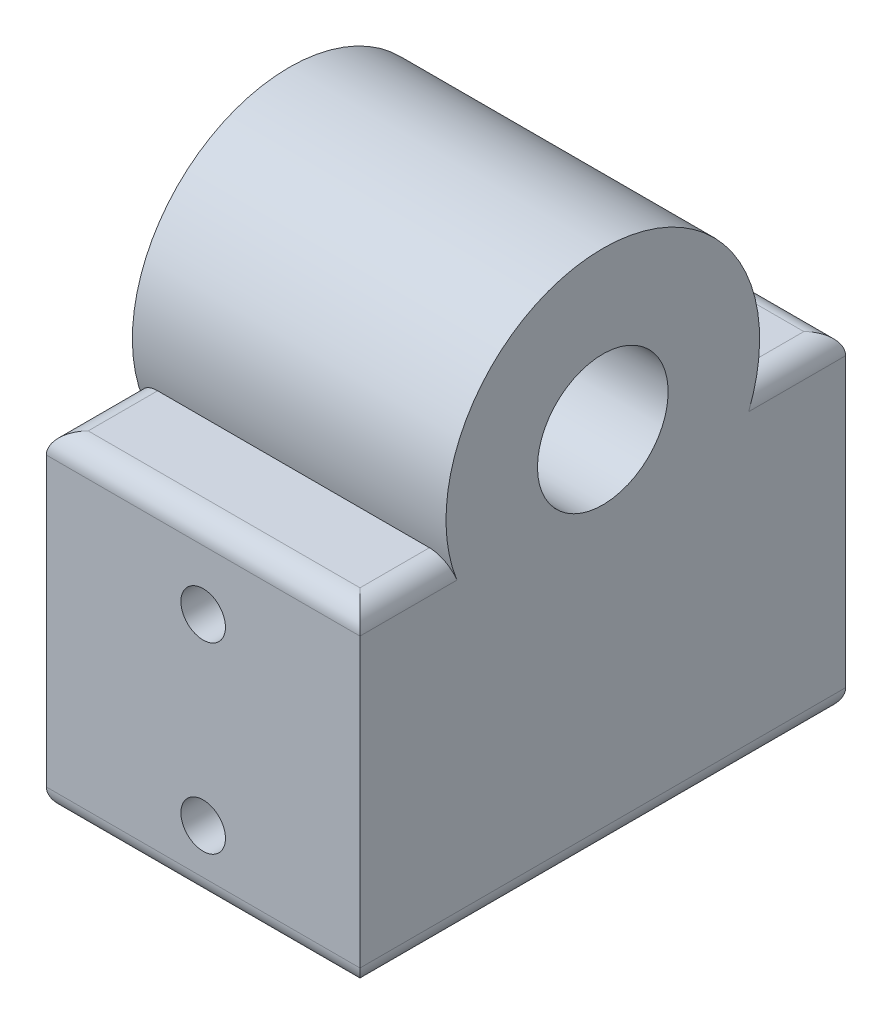
ISO-10303-21;
HEADER;
FILE_DESCRIPTION(('STEP AP214'),'2;1');
FILE_NAME('part.step','',(''),(''),'','','');
FILE_SCHEMA(('AUTOMOTIVE_DESIGN { 1 0 10303 214 1 1 1 1 }'));
ENDSEC;
DATA;
#1=APPLICATION_CONTEXT('core data for automotive mechanical design processes');
#2=APPLICATION_PROTOCOL_DEFINITION('international standard','automotive_design',2000,#1);
#3=PRODUCT_CONTEXT('',#1,'mechanical');
#4=PRODUCT('Part','Part','',(#3));
#5=PRODUCT_RELATED_PRODUCT_CATEGORY('part','',(#4));
#6=PRODUCT_DEFINITION_FORMATION('','',#4);
#7=PRODUCT_DEFINITION_CONTEXT('part definition',#1,'design');
#8=PRODUCT_DEFINITION('design','',#6,#7);
#9=PRODUCT_DEFINITION_SHAPE('','',#8);
#10=(LENGTH_UNIT() NAMED_UNIT(*) SI_UNIT(.MILLI.,.METRE.));
#11=(NAMED_UNIT(*) PLANE_ANGLE_UNIT() SI_UNIT($,.RADIAN.));
#12=(NAMED_UNIT(*) SI_UNIT($,.STERADIAN.) SOLID_ANGLE_UNIT());
#13=UNCERTAINTY_MEASURE_WITH_UNIT(LENGTH_MEASURE(1.E-05),#10,'distance_accuracy_value','');
#14=(GEOMETRIC_REPRESENTATION_CONTEXT(3) GLOBAL_UNCERTAINTY_ASSIGNED_CONTEXT((#13)) GLOBAL_UNIT_ASSIGNED_CONTEXT((#10,
#11,#12)) REPRESENTATION_CONTEXT('',''));
#15=CARTESIAN_POINT('',(0.,0.,0.));
#16=DIRECTION('',(0.,0.,1.));
#17=DIRECTION('',(1.,0.,0.));
#18=AXIS2_PLACEMENT_3D('',#15,#16,#17);
#19=CARTESIAN_POINT('',(9.525,-31.75,14.75));
#20=DIRECTION('',(1.,0.,0.));
#21=DIRECTION('',(0.,0.,-1.));
#22=AXIS2_PLACEMENT_3D('',#19,#20,#21);
#23=PLANE('',#22);
#24=CARTESIAN_POINT('',(9.525,-9.525,0.));
#25=DIRECTION('',(-1.,0.,0.));
#26=DIRECTION('',(0.,0.,1.));
#27=AXIS2_PLACEMENT_3D('',#24,#25,#26);
#28=CIRCLE('',#27,3.96875);
#29=CARTESIAN_POINT('',(9.525,-9.525,3.96875));
#30=VERTEX_POINT('',#29);
#31=EDGE_CURVE('E152',#30,#30,#28,.T.);
#32=ORIENTED_EDGE('',*,*,#31,.T.);
#33=EDGE_LOOP('',(#32));
#34=FACE_BOUND('',#33,.T.);
#35=DIRECTION('',(0.,1.,0.));
#36=VECTOR('',#35,1.);
#37=CARTESIAN_POINT('',(9.525,-31.75,-14.75));
#38=LINE('',#37,#36);
#39=CARTESIAN_POINT('',(9.525,-30.48,-14.75));
#40=VERTEX_POINT('',#39);
#41=CARTESIAN_POINT('',(9.525,-13.02,-14.75));
#42=VERTEX_POINT('',#41);
#43=EDGE_CURVE('E131',#40,#42,#38,.T.);
#44=ORIENTED_EDGE('',*,*,#43,.T.);
#45=DIRECTION('',(0.,0.,-1.));
#46=VECTOR('',#45,1.);
#47=CARTESIAN_POINT('',(9.525,-13.02,-9.26147936347104));
#48=LINE('',#47,#46);
#49=CARTESIAN_POINT('',(9.525,-13.02,-8.86062074574914));
#50=VERTEX_POINT('',#49);
#51=EDGE_CURVE('E192',#42,#50,#48,.F.);
#52=ORIENTED_EDGE('',*,*,#51,.T.);
#53=CARTESIAN_POINT('',(9.525,-9.525,0.));
#54=DIRECTION('',(1.,0.,0.));
#55=DIRECTION('',(0.,0.,-1.));
#56=AXIS2_PLACEMENT_3D('',#53,#54,#55);
#57=CIRCLE('',#56,9.525);
#58=CARTESIAN_POINT('',(9.525,-13.02,8.86062074574914));
#59=VERTEX_POINT('',#58);
#60=EDGE_CURVE('E314',#50,#59,#57,.T.);
#61=ORIENTED_EDGE('',*,*,#60,.T.);
#62=DIRECTION('',(0.,0.,-1.));
#63=VECTOR('',#62,1.);
#64=CARTESIAN_POINT('',(9.525,-13.02,14.75));
#65=LINE('',#64,#63);
#66=CARTESIAN_POINT('',(9.525,-13.02,14.75));
#67=VERTEX_POINT('',#66);
#68=EDGE_CURVE('E138',#59,#67,#65,.F.);
#69=ORIENTED_EDGE('',*,*,#68,.T.);
#70=DIRECTION('',(0.,1.,0.));
#71=VECTOR('',#70,1.);
#72=CARTESIAN_POINT('',(9.525,-31.75,14.75));
#73=LINE('',#72,#71);
#74=CARTESIAN_POINT('',(9.525,-30.48,14.75));
#75=VERTEX_POINT('',#74);
#76=EDGE_CURVE('E133',#75,#67,#73,.T.);
#77=ORIENTED_EDGE('',*,*,#76,.F.);
#78=DIRECTION('',(0.,0.,-1.));
#79=VECTOR('',#78,1.);
#80=CARTESIAN_POINT('',(9.525,-30.48,14.75));
#81=LINE('',#80,#79);
#82=EDGE_CURVE('E128',#75,#40,#81,.T.);
#83=ORIENTED_EDGE('',*,*,#82,.T.);
#84=EDGE_LOOP('',(#44,#52,#61,#69,#77,#83));
#85=FACE_BOUND('',#84,.T.);
#86=ADVANCED_FACE('F34',(#34,#85),#23,.T.);
#87=CARTESIAN_POINT('',(-9.525,-31.75,14.75));
#88=DIRECTION('',(-1.,0.,0.));
#89=DIRECTION('',(0.,0.,1.));
#90=AXIS2_PLACEMENT_3D('',#87,#88,#89);
#91=PLANE('',#90);
#92=CARTESIAN_POINT('',(-9.525,-9.525,0.));
#93=DIRECTION('',(-1.,0.,0.));
#94=DIRECTION('',(0.,0.,1.));
#95=AXIS2_PLACEMENT_3D('',#92,#93,#94);
#96=CIRCLE('',#95,3.96875);
#97=CARTESIAN_POINT('',(-9.525,-9.525,3.96875));
#98=VERTEX_POINT('',#97);
#99=EDGE_CURVE('E285',#98,#98,#96,.T.);
#100=ORIENTED_EDGE('',*,*,#99,.F.);
#101=EDGE_LOOP('',(#100));
#102=FACE_BOUND('',#101,.T.);
#103=CARTESIAN_POINT('',(-9.525,-9.525,0.));
#104=DIRECTION('',(1.,0.,0.));
#105=DIRECTION('',(0.,0.,-1.));
#106=AXIS2_PLACEMENT_3D('',#103,#104,#105);
#107=CIRCLE('',#106,9.525);
#108=CARTESIAN_POINT('',(-9.525,-13.02,-8.86062074574914));
#109=VERTEX_POINT('',#108);
#110=CARTESIAN_POINT('',(-9.525,-13.02,8.86062074574914));
#111=VERTEX_POINT('',#110);
#112=EDGE_CURVE('E316',#109,#111,#107,.T.);
#113=ORIENTED_EDGE('',*,*,#112,.F.);
#114=DIRECTION('',(0.,0.,-1.));
#115=VECTOR('',#114,1.);
#116=CARTESIAN_POINT('',(-9.525,-13.02,-14.75));
#117=LINE('',#116,#115);
#118=CARTESIAN_POINT('',(-9.525,-13.02,-14.75));
#119=VERTEX_POINT('',#118);
#120=EDGE_CURVE('E179',#109,#119,#117,.T.);
#121=ORIENTED_EDGE('',*,*,#120,.T.);
#122=DIRECTION('',(0.,1.,0.));
#123=VECTOR('',#122,1.);
#124=CARTESIAN_POINT('',(-9.525,-31.75,-14.75));
#125=LINE('',#124,#123);
#126=CARTESIAN_POINT('',(-9.525,-30.48,-14.75));
#127=VERTEX_POINT('',#126);
#128=EDGE_CURVE('E151',#127,#119,#125,.T.);
#129=ORIENTED_EDGE('',*,*,#128,.F.);
#130=DIRECTION('',(0.,0.,1.));
#131=VECTOR('',#130,1.);
#132=CARTESIAN_POINT('',(-9.525,-30.48,14.75));
#133=LINE('',#132,#131);
#134=CARTESIAN_POINT('',(-9.525,-30.48,14.75));
#135=VERTEX_POINT('',#134);
#136=EDGE_CURVE('E173',#127,#135,#133,.T.);
#137=ORIENTED_EDGE('',*,*,#136,.T.);
#138=DIRECTION('',(0.,1.,0.));
#139=VECTOR('',#138,1.);
#140=CARTESIAN_POINT('',(-9.525,-31.75,14.75));
#141=LINE('',#140,#139);
#142=CARTESIAN_POINT('',(-9.525,-13.02,14.75));
#143=VERTEX_POINT('',#142);
#144=EDGE_CURVE('E164',#135,#143,#141,.T.);
#145=ORIENTED_EDGE('',*,*,#144,.T.);
#146=DIRECTION('',(0.,0.,-1.));
#147=VECTOR('',#146,1.);
#148=CARTESIAN_POINT('',(-9.525,-13.02,9.26147936347104));
#149=LINE('',#148,#147);
#150=EDGE_CURVE('E176',#143,#111,#149,.T.);
#151=ORIENTED_EDGE('',*,*,#150,.T.);
#152=EDGE_LOOP('',(#113,#121,#129,#137,#145,#151));
#153=FACE_BOUND('',#152,.T.);
#154=ADVANCED_FACE('F251',(#102,#153),#91,.T.);
#155=CARTESIAN_POINT('',(-9.525,-31.75,14.75));
#156=DIRECTION('',(0.,0.,1.));
#157=DIRECTION('',(1.,0.,0.));
#158=AXIS2_PLACEMENT_3D('',#155,#156,#157);
#159=PLANE('',#158);
#160=ORIENTED_EDGE('',*,*,#76,.T.);
#161=DIRECTION('',(1.,0.,0.));
#162=VECTOR('',#161,1.);
#163=CARTESIAN_POINT('',(-9.525,-13.02,14.75));
#164=LINE('',#163,#162);
#165=EDGE_CURVE('E139',#67,#143,#164,.F.);
#166=ORIENTED_EDGE('',*,*,#165,.T.);
#167=ORIENTED_EDGE('',*,*,#144,.F.);
#168=DIRECTION('',(1.,0.,0.));
#169=VECTOR('',#168,1.);
#170=CARTESIAN_POINT('',(-9.525,-30.48,14.75));
#171=LINE('',#170,#169);
#172=EDGE_CURVE('E188',#135,#75,#171,.T.);
#173=ORIENTED_EDGE('',*,*,#172,.T.);
#174=EDGE_LOOP('',(#160,#166,#167,#173));
#175=FACE_BOUND('',#174,.T.);
#176=CARTESIAN_POINT('',(0.,-27.75,14.75));
#177=DIRECTION('',(0.,0.,1.));
#178=DIRECTION('',(1.,0.,0.));
#179=AXIS2_PLACEMENT_3D('',#176,#177,#178);
#180=CIRCLE('',#179,1.35254999999999);
#181=CARTESIAN_POINT('',(1.35254999999999,-27.75,14.75));
#182=VERTEX_POINT('',#181);
#183=EDGE_CURVE('E288',#182,#182,#180,.T.);
#184=ORIENTED_EDGE('',*,*,#183,.F.);
#185=EDGE_LOOP('',(#184));
#186=FACE_BOUND('',#185,.T.);
#187=CARTESIAN_POINT('',(0.,-16.6375,14.75));
#188=DIRECTION('',(0.,0.,1.));
#189=DIRECTION('',(1.,0.,0.));
#190=AXIS2_PLACEMENT_3D('',#187,#188,#189);
#191=CIRCLE('',#190,1.35254999999999);
#192=CARTESIAN_POINT('',(1.35254999999999,-16.6375,14.75));
#193=VERTEX_POINT('',#192);
#194=EDGE_CURVE('E281',#193,#193,#191,.T.);
#195=ORIENTED_EDGE('',*,*,#194,.F.);
#196=EDGE_LOOP('',(#195));
#197=FACE_BOUND('',#196,.T.);
#198=ADVANCED_FACE('F256',(#175,#186,#197),#159,.T.);
#199=CARTESIAN_POINT('',(-9.525,-31.75,-14.75));
#200=DIRECTION('',(0.,0.,-1.));
#201=DIRECTION('',(-1.,0.,0.));
#202=AXIS2_PLACEMENT_3D('',#199,#200,#201);
#203=PLANE('',#202);
#204=ORIENTED_EDGE('',*,*,#128,.T.);
#205=DIRECTION('',(1.,0.,0.));
#206=VECTOR('',#205,1.);
#207=CARTESIAN_POINT('',(9.525,-13.02,-14.75));
#208=LINE('',#207,#206);
#209=EDGE_CURVE('E150',#119,#42,#208,.T.);
#210=ORIENTED_EDGE('',*,*,#209,.T.);
#211=ORIENTED_EDGE('',*,*,#43,.F.);
#212=DIRECTION('',(-1.,0.,0.));
#213=VECTOR('',#212,1.);
#214=CARTESIAN_POINT('',(-9.525,-30.48,-14.75));
#215=LINE('',#214,#213);
#216=EDGE_CURVE('E147',#40,#127,#215,.T.);
#217=ORIENTED_EDGE('',*,*,#216,.T.);
#218=EDGE_LOOP('',(#204,#210,#211,#217));
#219=FACE_BOUND('',#218,.T.);
#220=CARTESIAN_POINT('',(0.,-27.75,-14.75));
#221=DIRECTION('',(0.,0.,1.));
#222=DIRECTION('',(1.,0.,0.));
#223=AXIS2_PLACEMENT_3D('',#220,#221,#222);
#224=CIRCLE('',#223,1.35255);
#225=CARTESIAN_POINT('',(1.35254999999999,-27.75,-14.75));
#226=VERTEX_POINT('',#225);
#227=EDGE_CURVE('E283',#226,#226,#224,.T.);
#228=ORIENTED_EDGE('',*,*,#227,.T.);
#229=EDGE_LOOP('',(#228));
#230=FACE_BOUND('',#229,.T.);
#231=CARTESIAN_POINT('',(0.,-16.6375,-14.75));
#232=DIRECTION('',(0.,0.,1.));
#233=DIRECTION('',(1.,0.,0.));
#234=AXIS2_PLACEMENT_3D('',#231,#232,#233);
#235=CIRCLE('',#234,1.35255);
#236=CARTESIAN_POINT('',(1.35254999999999,-16.6375,-14.75));
#237=VERTEX_POINT('',#236);
#238=EDGE_CURVE('E278',#237,#237,#235,.T.);
#239=ORIENTED_EDGE('',*,*,#238,.T.);
#240=EDGE_LOOP('',(#239));
#241=FACE_BOUND('',#240,.T.);
#242=ADVANCED_FACE('F144',(#219,#230,#241),#203,.T.);
#243=CARTESIAN_POINT('',(9.52499999999999,-31.75,-14.75));
#244=DIRECTION('',(0.,-1.,0.));
#245=DIRECTION('',(0.,0.,-1.));
#246=AXIS2_PLACEMENT_3D('',#243,#244,#245);
#247=PLANE('',#246);
#248=DIRECTION('',(1.,0.,0.));
#249=VECTOR('',#248,1.);
#250=CARTESIAN_POINT('',(9.52499999999999,-31.75,13.48));
#251=LINE('',#250,#249);
#252=CARTESIAN_POINT('',(8.255,-31.75,13.48));
#253=VERTEX_POINT('',#252);
#254=CARTESIAN_POINT('',(-8.255,-31.75,13.48));
#255=VERTEX_POINT('',#254);
#256=EDGE_CURVE('E59',#253,#255,#251,.F.);
#257=ORIENTED_EDGE('',*,*,#256,.T.);
#258=DIRECTION('',(0.,0.,1.));
#259=VECTOR('',#258,1.);
#260=CARTESIAN_POINT('',(-8.255,-31.75,-14.75));
#261=LINE('',#260,#259);
#262=CARTESIAN_POINT('',(-8.255,-31.75,-13.48));
#263=VERTEX_POINT('',#262);
#264=EDGE_CURVE('E198',#255,#263,#261,.F.);
#265=ORIENTED_EDGE('',*,*,#264,.T.);
#266=DIRECTION('',(-1.,0.,0.));
#267=VECTOR('',#266,1.);
#268=CARTESIAN_POINT('',(9.52499999999999,-31.75,-13.48));
#269=LINE('',#268,#267);
#270=CARTESIAN_POINT('',(8.255,-31.75,-13.48));
#271=VERTEX_POINT('',#270);
#272=EDGE_CURVE('E196',#263,#271,#269,.F.);
#273=ORIENTED_EDGE('',*,*,#272,.T.);
#274=DIRECTION('',(0.,0.,-1.));
#275=VECTOR('',#274,1.);
#276=CARTESIAN_POINT('',(8.255,-31.75,-14.75));
#277=LINE('',#276,#275);
#278=EDGE_CURVE('E156',#271,#253,#277,.F.);
#279=ORIENTED_EDGE('',*,*,#278,.T.);
#280=EDGE_LOOP('',(#257,#265,#273,#279));
#281=FACE_BOUND('',#280,.T.);
#282=ADVANCED_FACE('F255',(#281),#247,.T.);
#283=CARTESIAN_POINT('',(9.525,-9.525,0.));
#284=DIRECTION('',(-1.,0.,0.));
#285=DIRECTION('',(0.,0.,1.));
#286=AXIS2_PLACEMENT_3D('',#283,#284,#285);
#287=CYLINDRICAL_SURFACE('',#286,3.96875);
#288=CARTESIAN_POINT('',(9.525,-9.525,3.96875));
#289=CARTESIAN_POINT('',(9.3265625,-9.525,3.96875));
#290=CARTESIAN_POINT('',(9.128125,-9.525,3.96875));
#291=CARTESIAN_POINT('',(8.73125,-9.525,3.96875));
#292=CARTESIAN_POINT('',(8.5328125,-9.525,3.96875));
#293=CARTESIAN_POINT('',(8.1359375,-9.525,3.96875));
#294=CARTESIAN_POINT('',(7.9375,-9.525,3.96875));
#295=CARTESIAN_POINT('',(7.540625,-9.525,3.96875));
#296=CARTESIAN_POINT('',(7.3421875,-9.525,3.96875));
#297=CARTESIAN_POINT('',(6.9453125,-9.525,3.96875));
#298=CARTESIAN_POINT('',(6.746875,-9.525,3.96875));
#299=CARTESIAN_POINT('',(6.35,-9.525,3.96875));
#300=CARTESIAN_POINT('',(6.1515625,-9.525,3.96875));
#301=CARTESIAN_POINT('',(5.7546875,-9.525,3.96875));
#302=CARTESIAN_POINT('',(5.55625,-9.525,3.96875));
#303=CARTESIAN_POINT('',(5.159375,-9.525,3.96875));
#304=CARTESIAN_POINT('',(4.9609375,-9.525,3.96875));
#305=CARTESIAN_POINT('',(4.5640625,-9.525,3.96875));
#306=CARTESIAN_POINT('',(4.365625,-9.525,3.96875));
#307=CARTESIAN_POINT('',(3.96875,-9.525,3.96875));
#308=CARTESIAN_POINT('',(3.7703125,-9.525,3.96875));
#309=CARTESIAN_POINT('',(3.3734375,-9.525,3.96875));
#310=CARTESIAN_POINT('',(3.175,-9.525,3.96875));
#311=CARTESIAN_POINT('',(2.778125,-9.525,3.96875));
#312=CARTESIAN_POINT('',(2.5796875,-9.525,3.96875));
#313=CARTESIAN_POINT('',(2.1828125,-9.525,3.96875));
#314=CARTESIAN_POINT('',(1.984375,-9.525,3.96875));
#315=CARTESIAN_POINT('',(1.5875,-9.525,3.96875));
#316=CARTESIAN_POINT('',(1.3890625,-9.525,3.96875));
#317=CARTESIAN_POINT('',(0.992187499999999,-9.525,3.96875));
#318=CARTESIAN_POINT('',(0.793749999999999,-9.525,3.96875));
#319=CARTESIAN_POINT('',(0.396874999999998,-9.525,3.96875));
#320=CARTESIAN_POINT('',(0.198437499999998,-9.525,3.96875));
#321=CARTESIAN_POINT('',(-0.198437500000002,-9.525,3.96875));
#322=CARTESIAN_POINT('',(-0.396875000000002,-9.525,3.96875));
#323=CARTESIAN_POINT('',(-0.793750000000002,-9.525,3.96875));
#324=CARTESIAN_POINT('',(-0.992187500000002,-9.525,3.96875));
#325=CARTESIAN_POINT('',(-1.3890625,-9.525,3.96875));
#326=CARTESIAN_POINT('',(-1.5875,-9.525,3.96875));
#327=CARTESIAN_POINT('',(-1.984375,-9.525,3.96875));
#328=CARTESIAN_POINT('',(-2.1828125,-9.525,3.96875));
#329=CARTESIAN_POINT('',(-2.5796875,-9.525,3.96875));
#330=CARTESIAN_POINT('',(-2.778125,-9.525,3.96875));
#331=CARTESIAN_POINT('',(-3.175,-9.525,3.96875));
#332=CARTESIAN_POINT('',(-3.3734375,-9.525,3.96875));
#333=CARTESIAN_POINT('',(-3.7703125,-9.525,3.96875));
#334=CARTESIAN_POINT('',(-3.96875,-9.525,3.96875));
#335=CARTESIAN_POINT('',(-4.365625,-9.525,3.96875));
#336=CARTESIAN_POINT('',(-4.5640625,-9.525,3.96875));
#337=CARTESIAN_POINT('',(-4.9609375,-9.525,3.96875));
#338=CARTESIAN_POINT('',(-5.159375,-9.525,3.96875));
#339=CARTESIAN_POINT('',(-5.55625,-9.525,3.96875));
#340=CARTESIAN_POINT('',(-5.7546875,-9.525,3.96875));
#341=CARTESIAN_POINT('',(-6.1515625,-9.525,3.96875));
#342=CARTESIAN_POINT('',(-6.35,-9.525,3.96875));
#343=CARTESIAN_POINT('',(-6.746875,-9.525,3.96875));
#344=CARTESIAN_POINT('',(-6.9453125,-9.525,3.96875));
#345=CARTESIAN_POINT('',(-7.3421875,-9.525,3.96875));
#346=CARTESIAN_POINT('',(-7.540625,-9.525,3.96875));
#347=CARTESIAN_POINT('',(-7.9375,-9.525,3.96875));
#348=CARTESIAN_POINT('',(-8.1359375,-9.525,3.96875));
#349=CARTESIAN_POINT('',(-8.5328125,-9.525,3.96875));
#350=CARTESIAN_POINT('',(-8.73125,-9.525,3.96875));
#351=CARTESIAN_POINT('',(-9.128125,-9.525,3.96875));
#352=CARTESIAN_POINT('',(-9.3265625,-9.525,3.96875));
#353=CARTESIAN_POINT('',(-9.525,-9.525,3.96875));
#354=B_SPLINE_CURVE_WITH_KNOTS('',3,(#288,#289,#290,#291,#292,#293,#294,#295,#296,#297,#298,
#299,#300,#301,#302,#303,#304,#305,#306,#307,#308,#309,#310,#311,#312,#313,#314,#315,#316,#317,
#318,#319,#320,#321,#322,#323,#324,#325,#326,#327,#328,#329,#330,#331,#332,#333,#334,#335,#336,
#337,#338,#339,#340,#341,#342,#343,#344,#345,#346,#347,#348,#349,#350,#351,#352,#353),
.UNSPECIFIED.,.F.,.F.,(4,2,2,2,2,2,2,2,2,2,2,2,2,2,2,2,2,2,2,2,2,2,2,2,2,2,2,2,2,2,2,2,4),(0.,
0.595312499999999,1.190625,1.7859375,2.38125,2.9765625,3.571875,4.1671875,4.7625,5.3578125,
5.953125,6.5484375,7.14375,7.7390625,8.334375,8.9296875,9.525,10.1203125,10.715625,11.3109375,
11.90625,12.5015625,13.096875,13.6921875,14.2875,14.8828125,15.478125,16.0734375,16.66875,
17.2640625,17.859375,18.4546875,19.05),.UNSPECIFIED.);
#355=EDGE_CURVE('BSEAM265',#30,#98,#354,.T.);
#356=ORIENTED_EDGE('',*,*,#31,.F.);
#357=ORIENTED_EDGE('',*,*,#99,.T.);
#358=ORIENTED_EDGE('',*,*,#355,.T.);
#359=ORIENTED_EDGE('',*,*,#355,.F.);
#360=EDGE_LOOP('',(#356,#358,#357,#359));
#361=FACE_BOUND('',#360,.T.);
#362=ADVANCED_FACE('F265',(#361),#287,.F.);
#363=CARTESIAN_POINT('',(0.,-16.6375,14.75));
#364=DIRECTION('',(0.,0.,1.));
#365=DIRECTION('',(1.,0.,0.));
#366=AXIS2_PLACEMENT_3D('',#363,#364,#365);
#367=CYLINDRICAL_SURFACE('',#366,1.35254999999999);
#368=ORIENTED_EDGE('',*,*,#238,.F.);
#369=EDGE_LOOP('',(#368));
#370=FACE_BOUND('',#369,.T.);
#371=ORIENTED_EDGE('',*,*,#194,.T.);
#372=EDGE_LOOP('',(#371));
#373=FACE_BOUND('',#372,.T.);
#374=ADVANCED_FACE('F267',(#370,#373),#367,.F.);
#375=CARTESIAN_POINT('',(0.,-27.75,14.75));
#376=DIRECTION('',(0.,0.,1.));
#377=DIRECTION('',(1.,0.,0.));
#378=AXIS2_PLACEMENT_3D('',#375,#376,#377);
#379=CYLINDRICAL_SURFACE('',#378,1.35254999999999);
#380=ORIENTED_EDGE('',*,*,#227,.F.);
#381=EDGE_LOOP('',(#380));
#382=FACE_BOUND('',#381,.T.);
#383=ORIENTED_EDGE('',*,*,#183,.T.);
#384=EDGE_LOOP('',(#383));
#385=FACE_BOUND('',#384,.T.);
#386=ADVANCED_FACE('F224',(#382,#385),#379,.F.);
#387=CARTESIAN_POINT('',(-9.525,-9.525,0.));
#388=DIRECTION('',(1.,0.,0.));
#389=DIRECTION('',(0.,0.,-1.));
#390=AXIS2_PLACEMENT_3D('',#387,#388,#389);
#391=CYLINDRICAL_SURFACE('',#390,9.525);
#392=ORIENTED_EDGE('',*,*,#60,.F.);
#393=CARTESIAN_POINT('',(9.525,-13.02,-8.86062074574914));
#394=CARTESIAN_POINT('',(9.52499852252124,-12.9837594555083,-8.87491679310546));
#395=CARTESIAN_POINT('',(9.52344763491596,-12.947444217534,-8.88898249490261));
#396=CARTESIAN_POINT('',(9.51720715804546,-12.8748717904475,-8.91658505816372));
#397=CARTESIAN_POINT('',(9.51251670466538,-12.8386146200721,-8.93012177294661));
#398=CARTESIAN_POINT('',(9.49366705606685,-12.7302121082215,-8.96984631742909));
#399=CARTESIAN_POINT('',(9.4747294403631,-12.6584962313584,-8.9951247397921));
#400=CARTESIAN_POINT('',(9.42415425566406,-12.51846568558,-9.04269213892352));
#401=CARTESIAN_POINT('',(9.39248990705215,-12.4501585321737,-9.06497467897476));
#402=CARTESIAN_POINT('',(9.31703409311256,-12.3195288290174,-9.10609233824763));
#403=CARTESIAN_POINT('',(9.27325690856722,-12.2571993475341,-9.12493147400341));
#404=CARTESIAN_POINT('',(9.17702337334126,-12.1436162789671,-9.15815577536195));
#405=CARTESIAN_POINT('',(9.12508249276087,-12.0919754456382,-9.17271091631362));
#406=CARTESIAN_POINT('',(9.01256635222894,-11.9980606480837,-9.19847674745131));
#407=CARTESIAN_POINT('',(8.95198921642788,-11.9557887239538,-9.20968670940266));
#408=CARTESIAN_POINT('',(8.82672821707173,-11.88376469315,-9.22839019925457));
#409=CARTESIAN_POINT('',(8.76232280556198,-11.8535621894906,-9.23601977459137));
#410=CARTESIAN_POINT('',(8.62915155005819,-11.8042952912464,-9.2483019447314));
#411=CARTESIAN_POINT('',(8.56039025831628,-11.7852194744985,-9.25295759290517));
#412=CARTESIAN_POINT('',(8.4517036989843,-11.764701857239,-9.25793786569882));
#413=CARTESIAN_POINT('',(8.41254722546435,-11.7591907299943,-9.25926776933198));
#414=CARTESIAN_POINT('',(8.33393342437962,-11.7518417125628,-9.26103702416265));
#415=CARTESIAN_POINT('',(8.29447666769444,-11.7499980515437,-9.26147777447633));
#416=CARTESIAN_POINT('',(8.255,-11.75,-9.26147936347104));
#417=B_SPLINE_CURVE_WITH_KNOTS('',3,(#393,#394,#395,#396,#397,#398,#399,#400,#401,#402,#403,
#404,#405,#406,#407,#408,#409,#410,#411,#412,#413,#414,#415,#416),.UNSPECIFIED.,.F.,.F.,(4,2,2,
2,2,2,2,2,2,2,2,4),(0.,0.116811313541699,0.233654790742139,0.467534325253901,0.701908587770688,
0.936007696726002,1.15890627712569,1.38185334648571,1.5954581973756,1.80884338332348,
1.9273753283488,2.04572061296315),.UNSPECIFIED.);
#418=CARTESIAN_POINT('',(8.25499999999999,-11.75,-9.26147936347104));
#419=VERTEX_POINT('',#418);
#420=EDGE_CURVE('E43',#50,#419,#417,.T.);
#421=ORIENTED_EDGE('',*,*,#420,.T.);
#422=DIRECTION('',(1.,0.,0.));
#423=VECTOR('',#422,1.);
#424=CARTESIAN_POINT('',(-9.525,-11.75,-9.26147936347104));
#425=LINE('',#424,#423);
#426=CARTESIAN_POINT('',(-8.255,-11.75,-9.26147936347104));
#427=VERTEX_POINT('',#426);
#428=EDGE_CURVE('E306',#427,#419,#425,.T.);
#429=ORIENTED_EDGE('',*,*,#428,.F.);
#430=CARTESIAN_POINT('',(-8.255,-11.75,-9.26147936347104));
#431=CARTESIAN_POINT('',(-8.28988546416625,-11.7499997617744,-9.26147827397239));
#432=CARTESIAN_POINT('',(-8.32475409703772,-11.7514383558028,-9.26113393674278));
#433=CARTESIAN_POINT('',(-8.39423901803251,-11.7571743017108,-9.25975354665822));
#434=CARTESIAN_POINT('',(-8.42885532466467,-11.7614714417308,-9.2587175450656));
#435=CARTESIAN_POINT('',(-8.53185912083119,-11.7785982985028,-9.25457003499991));
#436=CARTESIAN_POINT('',(-8.59955188507159,-11.7956636368124,-9.25041905495199));
#437=CARTESIAN_POINT('',(-8.73101787834997,-11.8405341107289,-9.23928862839323));
#438=CARTESIAN_POINT('',(-8.79478969481093,-11.8683430909092,-9.23230816931951));
#439=CARTESIAN_POINT('',(-8.91666260680767,-11.9337756863117,-9.21545232152933));
#440=CARTESIAN_POINT('',(-8.97476403788935,-11.9713987203014,-9.20557710424923));
#441=CARTESIAN_POINT('',(-9.08413009873181,-12.0555123103738,-9.18281207468158));
#442=CARTESIAN_POINT('',(-9.13534424267374,-12.1020628569922,-9.16990172639049));
#443=CARTESIAN_POINT('',(-9.22919011262834,-12.2023385934781,-9.14112679187031));
#444=CARTESIAN_POINT('',(-9.27182119925102,-12.2560643173609,-9.1252619857199));
#445=CARTESIAN_POINT('',(-9.34851968611629,-12.3704066845409,-9.09026636281673));
#446=CARTESIAN_POINT('',(-9.38234875704403,-12.4311610722943,-9.07106436917676));
#447=CARTESIAN_POINT('',(-9.43944576369574,-12.5566003155145,-9.02991598310287));
#448=CARTESIAN_POINT('',(-9.46270941897814,-12.6212867519877,-9.00796848294706));
#449=CARTESIAN_POINT('',(-9.49544444755144,-12.7417563530861,-8.96557109416331));
#450=CARTESIAN_POINT('',(-9.50656805762352,-12.7972271046851,-8.9454810018504));
#451=CARTESIAN_POINT('',(-9.52134548100077,-12.9085403432749,-8.90398003913688));
#452=CARTESIAN_POINT('',(-9.52501444301737,-12.964381844571,-8.88257193853481));
#453=CARTESIAN_POINT('',(-9.525,-13.02,-8.86062074574913));
#454=B_SPLINE_CURVE_WITH_KNOTS('',3,(#430,#431,#432,#433,#434,#435,#436,#437,#438,#439,#440,
#441,#442,#443,#444,#445,#446,#447,#448,#449,#450,#451,#452,#453),.UNSPECIFIED.,.F.,.F.,(4,2,2,
2,2,2,2,2,2,2,2,4),(0.,0.10459167049381,0.209175590092228,0.417898017937991,0.626695205636104,
0.835480030228224,1.04572037702655,1.25597637977036,1.47144141584401,1.68699366709148,
1.866629975045,2.04590087456297),.UNSPECIFIED.);
#455=EDGE_CURVE('E200',#427,#109,#454,.T.);
#456=ORIENTED_EDGE('',*,*,#455,.T.);
#457=ORIENTED_EDGE('',*,*,#112,.T.);
#458=CARTESIAN_POINT('',(-9.525,-13.02,8.86062074574914));
#459=CARTESIAN_POINT('',(-9.52499852252125,-12.9837594555083,8.87491679310546));
#460=CARTESIAN_POINT('',(-9.52344763491596,-12.947444217534,8.88898249490261));
#461=CARTESIAN_POINT('',(-9.51720715804547,-12.8748717904475,8.91658505816372));
#462=CARTESIAN_POINT('',(-9.51251670466538,-12.8386146200721,8.93012177294662));
#463=CARTESIAN_POINT('',(-9.49366705606685,-12.7302121082215,8.96984631742909));
#464=CARTESIAN_POINT('',(-9.4747294403631,-12.6584962313584,8.9951247397921));
#465=CARTESIAN_POINT('',(-9.42415425566406,-12.51846568558,9.04269213892352));
#466=CARTESIAN_POINT('',(-9.39248990705215,-12.4501585321737,9.06497467897477));
#467=CARTESIAN_POINT('',(-9.31703409311256,-12.3195288290174,9.10609233824763));
#468=CARTESIAN_POINT('',(-9.27325690856723,-12.2571993475341,9.12493147400342));
#469=CARTESIAN_POINT('',(-9.17702337334126,-12.1436162789671,9.15815577536195));
#470=CARTESIAN_POINT('',(-9.12508249276087,-12.0919754456382,9.17271091631362));
#471=CARTESIAN_POINT('',(-9.01256635222895,-11.9980606480837,9.19847674745131));
#472=CARTESIAN_POINT('',(-8.95198921642788,-11.9557887239538,9.20968670940266));
#473=CARTESIAN_POINT('',(-8.82672821707174,-11.88376469315,9.22839019925457));
#474=CARTESIAN_POINT('',(-8.76232280556198,-11.8535621894906,9.23601977459137));
#475=CARTESIAN_POINT('',(-8.62915155005819,-11.8042952912464,9.2483019447314));
#476=CARTESIAN_POINT('',(-8.56039025831628,-11.7852194744985,9.25295759290517));
#477=CARTESIAN_POINT('',(-8.45170369898431,-11.764701857239,9.25793786569882));
#478=CARTESIAN_POINT('',(-8.41254722546435,-11.7591907299943,9.25926776933199));
#479=CARTESIAN_POINT('',(-8.33393342437963,-11.7518417125628,9.26103702416265));
#480=CARTESIAN_POINT('',(-8.29447666769444,-11.7499980515437,9.26147777447633));
#481=CARTESIAN_POINT('',(-8.255,-11.75,9.26147936347104));
#482=B_SPLINE_CURVE_WITH_KNOTS('',3,(#458,#459,#460,#461,#462,#463,#464,#465,#466,#467,#468,
#469,#470,#471,#472,#473,#474,#475,#476,#477,#478,#479,#480,#481),.UNSPECIFIED.,.F.,.F.,(4,2,2,
2,2,2,2,2,2,2,2,4),(0.,0.116811313541699,0.233654790742139,0.467534325253901,0.701908587770688,
0.936007696726002,1.15890627712569,1.38185334648571,1.5954581973756,1.80884338332348,
1.9273753283488,2.04572061296315),.UNSPECIFIED.);
#483=CARTESIAN_POINT('',(-8.255,-11.75,9.26147936347104));
#484=VERTEX_POINT('',#483);
#485=EDGE_CURVE('E208',#111,#484,#482,.T.);
#486=ORIENTED_EDGE('',*,*,#485,.T.);
#487=DIRECTION('',(1.,0.,0.));
#488=VECTOR('',#487,1.);
#489=CARTESIAN_POINT('',(-9.525,-11.75,9.26147936347104));
#490=LINE('',#489,#488);
#491=CARTESIAN_POINT('',(8.25499999999999,-11.75,9.26147936347104));
#492=VERTEX_POINT('',#491);
#493=EDGE_CURVE('E321',#484,#492,#490,.T.);
#494=ORIENTED_EDGE('',*,*,#493,.T.);
#495=CARTESIAN_POINT('',(8.255,-11.75,9.26147936347104));
#496=CARTESIAN_POINT('',(8.28988546416625,-11.7499997617744,9.2614782739724));
#497=CARTESIAN_POINT('',(8.32475409703771,-11.7514383558028,9.26113393674278));
#498=CARTESIAN_POINT('',(8.3942390180325,-11.7571743017108,9.25975354665822));
#499=CARTESIAN_POINT('',(8.42885532466467,-11.7614714417308,9.25871754506561));
#500=CARTESIAN_POINT('',(8.53185912083119,-11.7785982985028,9.25457003499992));
#501=CARTESIAN_POINT('',(8.59955188507158,-11.7956636368124,9.25041905495199));
#502=CARTESIAN_POINT('',(8.73101787834996,-11.8405341107289,9.23928862839323));
#503=CARTESIAN_POINT('',(8.79478969481093,-11.8683430909092,9.23230816931951));
#504=CARTESIAN_POINT('',(8.91666260680767,-11.9337756863117,9.21545232152933));
#505=CARTESIAN_POINT('',(8.97476403788935,-11.9713987203014,9.20557710424923));
#506=CARTESIAN_POINT('',(9.0841300987318,-12.0555123103738,9.18281207468159));
#507=CARTESIAN_POINT('',(9.13534424267373,-12.1020628569922,9.16990172639049));
#508=CARTESIAN_POINT('',(9.22919011262834,-12.2023385934781,9.14112679187032));
#509=CARTESIAN_POINT('',(9.27182119925101,-12.2560643173609,9.1252619857199));
#510=CARTESIAN_POINT('',(9.34851968611629,-12.3704066845409,9.09026636281674));
#511=CARTESIAN_POINT('',(9.38234875704402,-12.4311610722943,9.07106436917676));
#512=CARTESIAN_POINT('',(9.43944576369574,-12.5566003155145,9.02991598310287));
#513=CARTESIAN_POINT('',(9.46270941897813,-12.6212867519877,9.00796848294707));
#514=CARTESIAN_POINT('',(9.49544444755144,-12.7417563530861,8.96557109416331));
#515=CARTESIAN_POINT('',(9.50656805762351,-12.7972271046851,8.9454810018504));
#516=CARTESIAN_POINT('',(9.52134548100076,-12.9085403432749,8.90398003913689));
#517=CARTESIAN_POINT('',(9.52501444301737,-12.964381844571,8.88257193853481));
#518=CARTESIAN_POINT('',(9.525,-13.02,8.86062074574914));
#519=B_SPLINE_CURVE_WITH_KNOTS('',3,(#495,#496,#497,#498,#499,#500,#501,#502,#503,#504,#505,
#506,#507,#508,#509,#510,#511,#512,#513,#514,#515,#516,#517,#518),.UNSPECIFIED.,.F.,.F.,(4,2,2,
2,2,2,2,2,2,2,2,4),(0.,0.10459167049381,0.209175590092228,0.417898017937991,0.626695205636104,
0.835480030228224,1.04572037702655,1.25597637977036,1.47144141584401,1.68699366709148,
1.866629975045,2.04590087456297),.UNSPECIFIED.);
#520=EDGE_CURVE('E11',#492,#59,#519,.T.);
#521=ORIENTED_EDGE('',*,*,#520,.T.);
#522=EDGE_LOOP('',(#392,#421,#429,#456,#457,#486,#494,#521));
#523=FACE_BOUND('',#522,.T.);
#524=ADVANCED_FACE('F218',(#523),#391,.T.);
#525=CARTESIAN_POINT('',(-9.525,-11.75,-33.8516432852012));
#526=DIRECTION('',(0.,-1.,0.));
#527=DIRECTION('',(0.,0.,-1.));
#528=AXIS2_PLACEMENT_3D('',#525,#526,#527);
#529=PLANE('',#528);
#530=ORIENTED_EDGE('',*,*,#493,.F.);
#531=DIRECTION('',(0.,0.,-1.));
#532=VECTOR('',#531,1.);
#533=CARTESIAN_POINT('',(-8.255,-11.75,14.75));
#534=LINE('',#533,#532);
#535=CARTESIAN_POINT('',(-8.255,-11.75,13.48));
#536=VERTEX_POINT('',#535);
#537=EDGE_CURVE('E186',#484,#536,#534,.F.);
#538=ORIENTED_EDGE('',*,*,#537,.T.);
#539=DIRECTION('',(1.,0.,0.));
#540=VECTOR('',#539,1.);
#541=CARTESIAN_POINT('',(9.525,-11.75,13.48));
#542=LINE('',#541,#540);
#543=CARTESIAN_POINT('',(8.255,-11.75,13.48));
#544=VERTEX_POINT('',#543);
#545=EDGE_CURVE('E183',#536,#544,#542,.T.);
#546=ORIENTED_EDGE('',*,*,#545,.T.);
#547=DIRECTION('',(0.,0.,-1.));
#548=VECTOR('',#547,1.);
#549=CARTESIAN_POINT('',(8.255,-11.75,9.26147936347105));
#550=LINE('',#549,#548);
#551=EDGE_CURVE('E181',#544,#492,#550,.T.);
#552=ORIENTED_EDGE('',*,*,#551,.T.);
#553=EDGE_LOOP('',(#530,#538,#546,#552));
#554=FACE_BOUND('',#553,.T.);
#555=ADVANCED_FACE('F223',(#554),#529,.F.);
#556=CARTESIAN_POINT('',(-9.525,-11.75,-33.8516432852012));
#557=DIRECTION('',(0.,-1.,0.));
#558=DIRECTION('',(0.,0.,-1.));
#559=AXIS2_PLACEMENT_3D('',#556,#557,#558);
#560=PLANE('',#559);
#561=DIRECTION('',(1.,0.,0.));
#562=VECTOR('',#561,1.);
#563=CARTESIAN_POINT('',(-9.525,-11.75,-13.48));
#564=LINE('',#563,#562);
#565=CARTESIAN_POINT('',(8.255,-11.75,-13.48));
#566=VERTEX_POINT('',#565);
#567=CARTESIAN_POINT('',(-8.255,-11.75,-13.48));
#568=VERTEX_POINT('',#567);
#569=EDGE_CURVE('E169',#566,#568,#564,.F.);
#570=ORIENTED_EDGE('',*,*,#569,.T.);
#571=DIRECTION('',(0.,0.,-1.));
#572=VECTOR('',#571,1.);
#573=CARTESIAN_POINT('',(-8.255,-11.75,-9.26147936347104));
#574=LINE('',#573,#572);
#575=EDGE_CURVE('E171',#568,#427,#574,.F.);
#576=ORIENTED_EDGE('',*,*,#575,.T.);
#577=ORIENTED_EDGE('',*,*,#428,.T.);
#578=DIRECTION('',(0.,0.,-1.));
#579=VECTOR('',#578,1.);
#580=CARTESIAN_POINT('',(8.255,-11.75,-14.75));
#581=LINE('',#580,#579);
#582=EDGE_CURVE('E162',#419,#566,#581,.T.);
#583=ORIENTED_EDGE('',*,*,#582,.T.);
#584=EDGE_LOOP('',(#570,#576,#577,#583));
#585=FACE_BOUND('',#584,.T.);
#586=ADVANCED_FACE('F357',(#585),#560,.F.);
#587=CARTESIAN_POINT('',(-8.255,-13.02,14.75));
#588=DIRECTION('',(0.,0.,1.));
#589=DIRECTION('',(1.,0.,0.));
#590=AXIS2_PLACEMENT_3D('',#587,#588,#589);
#591=CYLINDRICAL_SURFACE('',#590,1.27);
#592=ORIENTED_EDGE('',*,*,#455,.F.);
#593=ORIENTED_EDGE('',*,*,#575,.F.);
#594=CARTESIAN_POINT('',(-8.255,-13.02,-13.48));
#595=DIRECTION('',(-0.707106781186547,0.,0.707106781186547));
#596=DIRECTION('',(0.707106781186547,0.,0.707106781186547));
#597=AXIS2_PLACEMENT_3D('',#594,#595,#596);
#598=ELLIPSE('',#597,1.79605122421383,1.27);
#599=EDGE_CURVE('E303',#119,#568,#598,.F.);
#600=ORIENTED_EDGE('',*,*,#599,.F.);
#601=ORIENTED_EDGE('',*,*,#120,.F.);
#602=EDGE_LOOP('',(#592,#593,#600,#601));
#603=FACE_BOUND('',#602,.T.);
#604=ADVANCED_FACE('F214',(#603),#591,.T.);
#605=CARTESIAN_POINT('',(8.255,-13.02,-33.8516432852012));
#606=DIRECTION('',(0.,0.,1.));
#607=DIRECTION('',(1.,0.,0.));
#608=AXIS2_PLACEMENT_3D('',#605,#606,#607);
#609=CYLINDRICAL_SURFACE('',#608,1.27);
#610=ORIENTED_EDGE('',*,*,#420,.F.);
#611=ORIENTED_EDGE('',*,*,#51,.F.);
#612=CARTESIAN_POINT('',(8.255,-13.02,-13.48));
#613=DIRECTION('',(0.707106781186547,0.,0.707106781186547));
#614=DIRECTION('',(-0.707106781186547,0.,0.707106781186547));
#615=AXIS2_PLACEMENT_3D('',#612,#613,#614);
#616=ELLIPSE('',#615,1.79605122421383,1.27);
#617=EDGE_CURVE('E307',#566,#42,#616,.F.);
#618=ORIENTED_EDGE('',*,*,#617,.F.);
#619=ORIENTED_EDGE('',*,*,#582,.F.);
#620=EDGE_LOOP('',(#610,#611,#618,#619));
#621=FACE_BOUND('',#620,.T.);
#622=ADVANCED_FACE('F239',(#621),#609,.T.);
#623=CARTESIAN_POINT('',(-9.525,-13.02,-13.48));
#624=DIRECTION('',(-1.,0.,0.));
#625=DIRECTION('',(0.,0.,1.));
#626=AXIS2_PLACEMENT_3D('',#623,#624,#625);
#627=CYLINDRICAL_SURFACE('',#626,1.27);
#628=ORIENTED_EDGE('',*,*,#599,.T.);
#629=ORIENTED_EDGE('',*,*,#569,.F.);
#630=ORIENTED_EDGE('',*,*,#617,.T.);
#631=ORIENTED_EDGE('',*,*,#209,.F.);
#632=EDGE_LOOP('',(#628,#629,#630,#631));
#633=FACE_BOUND('',#632,.T.);
#634=ADVANCED_FACE('F243',(#633),#627,.T.);
#635=CARTESIAN_POINT('',(-8.255,-13.02,14.75));
#636=DIRECTION('',(0.,0.,1.));
#637=DIRECTION('',(1.,0.,0.));
#638=AXIS2_PLACEMENT_3D('',#635,#636,#637);
#639=CYLINDRICAL_SURFACE('',#638,1.27);
#640=ORIENTED_EDGE('',*,*,#485,.F.);
#641=ORIENTED_EDGE('',*,*,#150,.F.);
#642=CARTESIAN_POINT('',(-8.255,-13.02,13.48));
#643=DIRECTION('',(0.707106781186547,0.,0.707106781186547));
#644=DIRECTION('',(-0.707106781186547,0.,0.707106781186547));
#645=AXIS2_PLACEMENT_3D('',#642,#643,#644);
#646=ELLIPSE('',#645,1.79605122421383,1.27);
#647=EDGE_CURVE('E312',#536,#143,#646,.T.);
#648=ORIENTED_EDGE('',*,*,#647,.F.);
#649=ORIENTED_EDGE('',*,*,#537,.F.);
#650=EDGE_LOOP('',(#640,#641,#648,#649));
#651=FACE_BOUND('',#650,.T.);
#652=ADVANCED_FACE('F247',(#651),#639,.T.);
#653=CARTESIAN_POINT('',(8.255,-13.02,-33.8516432852012));
#654=DIRECTION('',(0.,0.,1.));
#655=DIRECTION('',(1.,0.,0.));
#656=AXIS2_PLACEMENT_3D('',#653,#654,#655);
#657=CYLINDRICAL_SURFACE('',#656,1.27);
#658=ORIENTED_EDGE('',*,*,#520,.F.);
#659=ORIENTED_EDGE('',*,*,#551,.F.);
#660=CARTESIAN_POINT('',(8.255,-13.02,13.48));
#661=DIRECTION('',(-0.707106781186547,0.,0.707106781186547));
#662=DIRECTION('',(0.707106781186547,0.,0.707106781186547));
#663=AXIS2_PLACEMENT_3D('',#660,#661,#662);
#664=ELLIPSE('',#663,1.79605122421383,1.27);
#665=EDGE_CURVE('E158',#67,#544,#664,.T.);
#666=ORIENTED_EDGE('',*,*,#665,.F.);
#667=ORIENTED_EDGE('',*,*,#68,.F.);
#668=EDGE_LOOP('',(#658,#659,#666,#667));
#669=FACE_BOUND('',#668,.T.);
#670=ADVANCED_FACE('F325',(#669),#657,.T.);
#671=CARTESIAN_POINT('',(-9.525,-13.02,13.48));
#672=DIRECTION('',(-1.,0.,0.));
#673=DIRECTION('',(0.,0.,1.));
#674=AXIS2_PLACEMENT_3D('',#671,#672,#673);
#675=CYLINDRICAL_SURFACE('',#674,1.27);
#676=ORIENTED_EDGE('',*,*,#647,.T.);
#677=ORIENTED_EDGE('',*,*,#165,.F.);
#678=ORIENTED_EDGE('',*,*,#665,.T.);
#679=ORIENTED_EDGE('',*,*,#545,.F.);
#680=EDGE_LOOP('',(#676,#677,#678,#679));
#681=FACE_BOUND('',#680,.T.);
#682=ADVANCED_FACE('F343',(#681),#675,.T.);
#683=CARTESIAN_POINT('',(8.255,-30.48,14.75));
#684=DIRECTION('',(0.,0.,-1.));
#685=DIRECTION('',(-1.,0.,0.));
#686=AXIS2_PLACEMENT_3D('',#683,#684,#685);
#687=CYLINDRICAL_SURFACE('',#686,1.27);
#688=CARTESIAN_POINT('',(8.255,-30.48,13.48));
#689=DIRECTION('',(0.707106781186547,0.,-0.707106781186547));
#690=DIRECTION('',(-0.707106781186547,0.,-0.707106781186547));
#691=AXIS2_PLACEMENT_3D('',#688,#689,#690);
#692=ELLIPSE('',#691,1.79605122421383,1.27);
#693=EDGE_CURVE('E159',#253,#75,#692,.F.);
#694=ORIENTED_EDGE('',*,*,#693,.F.);
#695=ORIENTED_EDGE('',*,*,#278,.F.);
#696=CARTESIAN_POINT('',(8.255,-30.48,-13.48));
#697=DIRECTION('',(-0.707106781186547,0.,-0.707106781186547));
#698=DIRECTION('',(0.707106781186547,0.,-0.707106781186547));
#699=AXIS2_PLACEMENT_3D('',#696,#697,#698);
#700=ELLIPSE('',#699,1.79605122421383,1.27);
#701=EDGE_CURVE('E38',#40,#271,#700,.T.);
#702=ORIENTED_EDGE('',*,*,#701,.F.);
#703=ORIENTED_EDGE('',*,*,#82,.F.);
#704=EDGE_LOOP('',(#694,#695,#702,#703));
#705=FACE_BOUND('',#704,.T.);
#706=ADVANCED_FACE('F36',(#705),#687,.T.);
#707=CARTESIAN_POINT('',(-9.525,-30.48,-13.48));
#708=DIRECTION('',(-1.,0.,0.));
#709=DIRECTION('',(0.,0.,1.));
#710=AXIS2_PLACEMENT_3D('',#707,#708,#709);
#711=CYLINDRICAL_SURFACE('',#710,1.27);
#712=ORIENTED_EDGE('',*,*,#701,.T.);
#713=ORIENTED_EDGE('',*,*,#272,.F.);
#714=CARTESIAN_POINT('',(-8.255,-30.48,-13.48));
#715=DIRECTION('',(-0.707106781186547,0.,0.707106781186547));
#716=DIRECTION('',(-0.707106781186547,0.,-0.707106781186547));
#717=AXIS2_PLACEMENT_3D('',#714,#715,#716);
#718=ELLIPSE('',#717,1.79605122421383,1.27);
#719=EDGE_CURVE('E51',#127,#263,#718,.T.);
#720=ORIENTED_EDGE('',*,*,#719,.F.);
#721=ORIENTED_EDGE('',*,*,#216,.F.);
#722=EDGE_LOOP('',(#712,#713,#720,#721));
#723=FACE_BOUND('',#722,.T.);
#724=ADVANCED_FACE('F160',(#723),#711,.T.);
#725=CARTESIAN_POINT('',(-9.525,-30.48,13.48));
#726=DIRECTION('',(1.,0.,0.));
#727=DIRECTION('',(0.,0.,-1.));
#728=AXIS2_PLACEMENT_3D('',#725,#726,#727);
#729=CYLINDRICAL_SURFACE('',#728,1.27);
#730=ORIENTED_EDGE('',*,*,#693,.T.);
#731=ORIENTED_EDGE('',*,*,#172,.F.);
#732=CARTESIAN_POINT('',(-8.255,-30.48,13.48));
#733=DIRECTION('',(0.707106781186547,0.,0.707106781186547));
#734=DIRECTION('',(0.707106781186547,0.,-0.707106781186547));
#735=AXIS2_PLACEMENT_3D('',#732,#733,#734);
#736=ELLIPSE('',#735,1.79605122421383,1.27);
#737=EDGE_CURVE('E333',#255,#135,#736,.F.);
#738=ORIENTED_EDGE('',*,*,#737,.F.);
#739=ORIENTED_EDGE('',*,*,#256,.F.);
#740=EDGE_LOOP('',(#730,#731,#738,#739));
#741=FACE_BOUND('',#740,.T.);
#742=ADVANCED_FACE('F337',(#741),#729,.T.);
#743=CARTESIAN_POINT('',(-8.255,-30.48,14.75));
#744=DIRECTION('',(0.,0.,1.));
#745=DIRECTION('',(1.,0.,0.));
#746=AXIS2_PLACEMENT_3D('',#743,#744,#745);
#747=CYLINDRICAL_SURFACE('',#746,1.27);
#748=ORIENTED_EDGE('',*,*,#719,.T.);
#749=ORIENTED_EDGE('',*,*,#264,.F.);
#750=ORIENTED_EDGE('',*,*,#737,.T.);
#751=ORIENTED_EDGE('',*,*,#136,.F.);
#752=EDGE_LOOP('',(#748,#749,#750,#751));
#753=FACE_BOUND('',#752,.T.);
#754=ADVANCED_FACE('F339',(#753),#747,.T.);
#755=CLOSED_SHELL('',(#86,#154,#198,#242,#282,#362,#374,#386,#524,#555,#586,#604,#622,#634,#652,
#670,#682,#706,#724,#742,#754));
#756=MANIFOLD_SOLID_BREP('B2',#755);
#757=ADVANCED_BREP_SHAPE_REPRESENTATION('',(#18,#756),#14);
#758=SHAPE_DEFINITION_REPRESENTATION(#9,#757);
ENDSEC;
END-ISO-10303-21;
